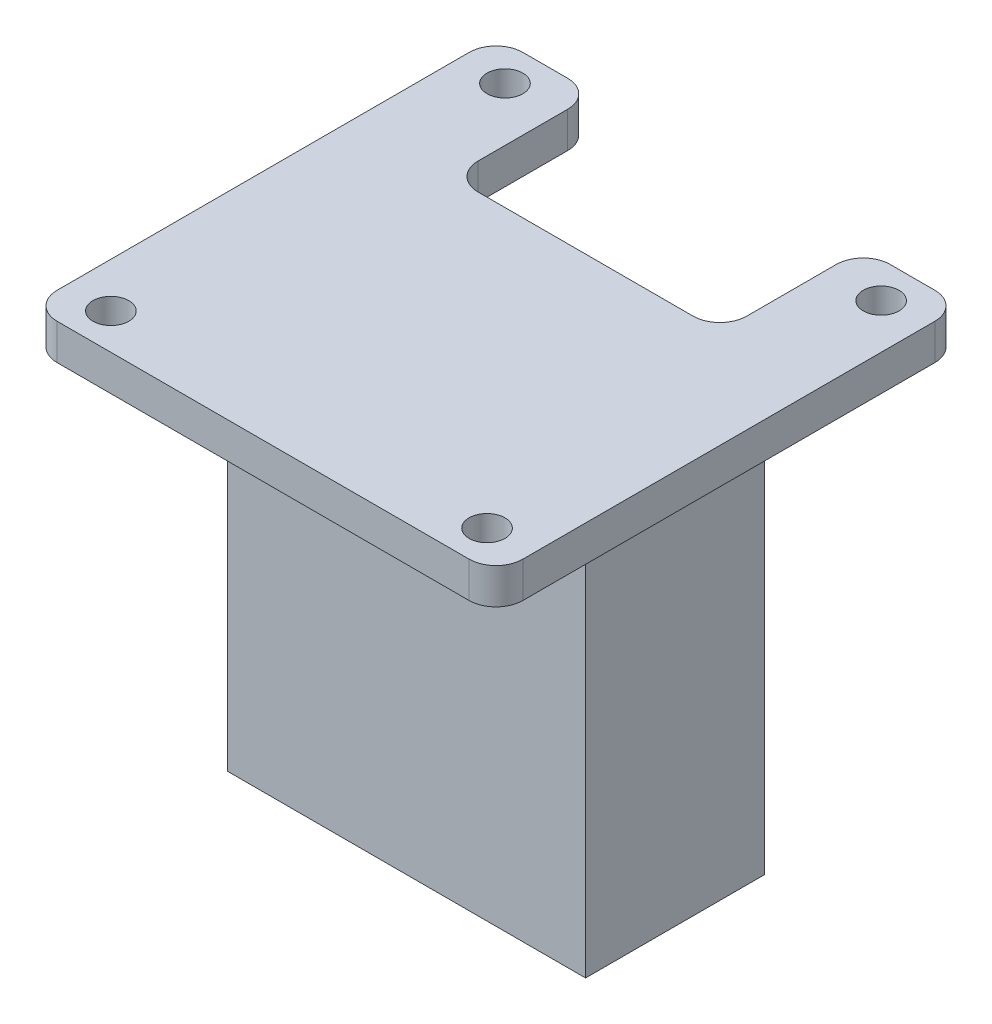
ISO-10303-21;
HEADER;
FILE_DESCRIPTION(('STEP AP214'),'2;1');
FILE_NAME('part.step','',(''),(''),'','','');
FILE_SCHEMA(('AUTOMOTIVE_DESIGN { 1 0 10303 214 1 1 1 1 }'));
ENDSEC;
DATA;
#1=APPLICATION_CONTEXT('core data for automotive mechanical design processes');
#2=APPLICATION_PROTOCOL_DEFINITION('international standard','automotive_design',2000,#1);
#3=PRODUCT_CONTEXT('',#1,'mechanical');
#4=PRODUCT('Part','Part','',(#3));
#5=PRODUCT_RELATED_PRODUCT_CATEGORY('part','',(#4));
#6=PRODUCT_DEFINITION_FORMATION('','',#4);
#7=PRODUCT_DEFINITION_CONTEXT('part definition',#1,'design');
#8=PRODUCT_DEFINITION('design','',#6,#7);
#9=PRODUCT_DEFINITION_SHAPE('','',#8);
#10=(LENGTH_UNIT() NAMED_UNIT(*) SI_UNIT(.MILLI.,.METRE.));
#11=(NAMED_UNIT(*) PLANE_ANGLE_UNIT() SI_UNIT($,.RADIAN.));
#12=(NAMED_UNIT(*) SI_UNIT($,.STERADIAN.) SOLID_ANGLE_UNIT());
#13=UNCERTAINTY_MEASURE_WITH_UNIT(LENGTH_MEASURE(1.E-05),#10,'distance_accuracy_value','');
#14=(GEOMETRIC_REPRESENTATION_CONTEXT(3) GLOBAL_UNCERTAINTY_ASSIGNED_CONTEXT((#13)) GLOBAL_UNIT_ASSIGNED_CONTEXT((#10,
#11,#12)) REPRESENTATION_CONTEXT('',''));
#15=CARTESIAN_POINT('',(0.,0.,0.));
#16=DIRECTION('',(0.,0.,1.));
#17=DIRECTION('',(1.,0.,0.));
#18=AXIS2_PLACEMENT_3D('',#15,#16,#17);
#19=CARTESIAN_POINT('',(13.,25.,-13.));
#20=DIRECTION('',(0.,0.,1.));
#21=DIRECTION('',(1.,0.,0.));
#22=AXIS2_PLACEMENT_3D('',#19,#20,#21);
#23=PLANE('',#22);
#24=DIRECTION('',(-1.,0.,0.));
#25=VECTOR('',#24,1.);
#26=CARTESIAN_POINT('',(13.,23.,-13.));
#27=LINE('',#26,#25);
#28=CARTESIAN_POINT('',(-9.,23.,-13.));
#29=VERTEX_POINT('',#28);
#30=CARTESIAN_POINT('',(-11.5,23.,-13.));
#31=VERTEX_POINT('',#30);
#32=EDGE_CURVE('E391',#29,#31,#27,.T.);
#33=ORIENTED_EDGE('',*,*,#32,.T.);
#34=DIRECTION('',(0.,-1.,0.));
#35=VECTOR('',#34,1.);
#36=CARTESIAN_POINT('',(-11.5,25.,-13.));
#37=LINE('',#36,#35);
#38=CARTESIAN_POINT('',(-11.5,25.,-13.));
#39=VERTEX_POINT('',#38);
#40=EDGE_CURVE('E252',#31,#39,#37,.F.);
#41=ORIENTED_EDGE('',*,*,#40,.T.);
#42=DIRECTION('',(-1.,0.,0.));
#43=VECTOR('',#42,1.);
#44=CARTESIAN_POINT('',(13.,25.,-13.));
#45=LINE('',#44,#43);
#46=CARTESIAN_POINT('',(-9.,25.,-13.));
#47=VERTEX_POINT('',#46);
#48=EDGE_CURVE('E379',#47,#39,#45,.T.);
#49=ORIENTED_EDGE('',*,*,#48,.F.);
#50=DIRECTION('',(0.,-1.,0.));
#51=VECTOR('',#50,1.);
#52=CARTESIAN_POINT('',(-9.,25.,-13.));
#53=LINE('',#52,#51);
#54=EDGE_CURVE('E249',#47,#29,#53,.T.);
#55=ORIENTED_EDGE('',*,*,#54,.T.);
#56=EDGE_LOOP('',(#33,#41,#49,#55));
#57=FACE_BOUND('',#56,.T.);
#58=ADVANCED_FACE('F36',(#57),#23,.F.);
#59=CARTESIAN_POINT('',(0.,0.,0.));
#60=DIRECTION('',(0.,1.,0.));
#61=DIRECTION('',(0.,0.,1.));
#62=AXIS2_PLACEMENT_3D('',#59,#60,#61);
#63=PLANE('',#62);
#64=DIRECTION('',(0.,0.,1.));
#65=VECTOR('',#64,1.);
#66=CARTESIAN_POINT('',(-10.,0.,5.));
#67=LINE('',#66,#65);
#68=CARTESIAN_POINT('',(-10.,0.,-5.));
#69=VERTEX_POINT('',#68);
#70=CARTESIAN_POINT('',(-10.,0.,5.));
#71=VERTEX_POINT('',#70);
#72=EDGE_CURVE('E201',#69,#71,#67,.T.);
#73=ORIENTED_EDGE('',*,*,#72,.F.);
#74=DIRECTION('',(-1.,0.,0.));
#75=VECTOR('',#74,1.);
#76=CARTESIAN_POINT('',(10.,0.,-5.));
#77=LINE('',#76,#75);
#78=CARTESIAN_POINT('',(10.,0.,-5.));
#79=VERTEX_POINT('',#78);
#80=EDGE_CURVE('E217',#79,#69,#77,.T.);
#81=ORIENTED_EDGE('',*,*,#80,.F.);
#82=DIRECTION('',(0.,0.,-1.));
#83=VECTOR('',#82,1.);
#84=CARTESIAN_POINT('',(10.,0.,5.));
#85=LINE('',#84,#83);
#86=CARTESIAN_POINT('',(10.,0.,5.));
#87=VERTEX_POINT('',#86);
#88=EDGE_CURVE('E203',#87,#79,#85,.T.);
#89=ORIENTED_EDGE('',*,*,#88,.F.);
#90=DIRECTION('',(1.,0.,0.));
#91=VECTOR('',#90,1.);
#92=CARTESIAN_POINT('',(10.,0.,5.));
#93=LINE('',#92,#91);
#94=EDGE_CURVE('E188',#71,#87,#93,.T.);
#95=ORIENTED_EDGE('',*,*,#94,.F.);
#96=EDGE_LOOP('',(#73,#81,#89,#95));
#97=FACE_BOUND('',#96,.T.);
#98=CARTESIAN_POINT('',(0.,0.,-1.5));
#99=DIRECTION('',(0.,1.,0.));
#100=DIRECTION('',(0.,0.,1.));
#101=AXIS2_PLACEMENT_3D('',#98,#99,#100);
#102=CIRCLE('',#101,1.45);
#103=CARTESIAN_POINT('',(0.,0.,-0.0499999999999997));
#104=VERTEX_POINT('',#103);
#105=EDGE_CURVE('E209',#104,#104,#102,.T.);
#106=ORIENTED_EDGE('',*,*,#105,.T.);
#107=EDGE_LOOP('',(#106));
#108=FACE_BOUND('',#107,.T.);
#109=ADVANCED_FACE('F198',(#97,#108),#63,.F.);
#110=CARTESIAN_POINT('',(-10.,23.,5.));
#111=DIRECTION('',(1.,0.,0.));
#112=DIRECTION('',(0.,0.,-1.));
#113=AXIS2_PLACEMENT_3D('',#110,#111,#112);
#114=PLANE('',#113);
#115=DIRECTION('',(0.,-1.,0.));
#116=VECTOR('',#115,1.);
#117=CARTESIAN_POINT('',(-10.,23.,5.));
#118=LINE('',#117,#116);
#119=CARTESIAN_POINT('',(-10.,21.5,5.));
#120=VERTEX_POINT('',#119);
#121=EDGE_CURVE('E185',#120,#71,#118,.T.);
#122=ORIENTED_EDGE('',*,*,#121,.F.);
#123=DIRECTION('',(0.,0.,1.));
#124=VECTOR('',#123,1.);
#125=CARTESIAN_POINT('',(-10.,21.5,-5.));
#126=LINE('',#125,#124);
#127=CARTESIAN_POINT('',(-10.,21.5,-5.));
#128=VERTEX_POINT('',#127);
#129=EDGE_CURVE('E301',#120,#128,#126,.F.);
#130=ORIENTED_EDGE('',*,*,#129,.T.);
#131=DIRECTION('',(0.,-1.,0.));
#132=VECTOR('',#131,1.);
#133=CARTESIAN_POINT('',(-10.,23.,-5.));
#134=LINE('',#133,#132);
#135=EDGE_CURVE('E207',#128,#69,#134,.T.);
#136=ORIENTED_EDGE('',*,*,#135,.T.);
#137=ORIENTED_EDGE('',*,*,#72,.T.);
#138=EDGE_LOOP('',(#122,#130,#136,#137));
#139=FACE_BOUND('',#138,.T.);
#140=ADVANCED_FACE('F205',(#139),#114,.F.);
#141=CARTESIAN_POINT('',(10.,23.,5.));
#142=DIRECTION('',(0.,0.,-1.));
#143=DIRECTION('',(-1.,0.,0.));
#144=AXIS2_PLACEMENT_3D('',#141,#142,#143);
#145=PLANE('',#144);
#146=DIRECTION('',(0.,-1.,0.));
#147=VECTOR('',#146,1.);
#148=CARTESIAN_POINT('',(10.,23.,5.));
#149=LINE('',#148,#147);
#150=CARTESIAN_POINT('',(10.,21.5,5.));
#151=VERTEX_POINT('',#150);
#152=EDGE_CURVE('E194',#151,#87,#149,.T.);
#153=ORIENTED_EDGE('',*,*,#152,.F.);
#154=DIRECTION('',(1.,0.,0.));
#155=VECTOR('',#154,1.);
#156=CARTESIAN_POINT('',(-10.,21.5,5.));
#157=LINE('',#156,#155);
#158=EDGE_CURVE('E53',#151,#120,#157,.F.);
#159=ORIENTED_EDGE('',*,*,#158,.T.);
#160=ORIENTED_EDGE('',*,*,#121,.T.);
#161=ORIENTED_EDGE('',*,*,#94,.T.);
#162=EDGE_LOOP('',(#153,#159,#160,#161));
#163=FACE_BOUND('',#162,.T.);
#164=ADVANCED_FACE('F187',(#163),#145,.F.);
#165=CARTESIAN_POINT('',(10.,23.,5.));
#166=DIRECTION('',(-1.,0.,0.));
#167=DIRECTION('',(0.,0.,1.));
#168=AXIS2_PLACEMENT_3D('',#165,#166,#167);
#169=PLANE('',#168);
#170=DIRECTION('',(0.,-1.,0.));
#171=VECTOR('',#170,1.);
#172=CARTESIAN_POINT('',(10.,23.,-5.));
#173=LINE('',#172,#171);
#174=CARTESIAN_POINT('',(10.,21.5,-5.));
#175=VERTEX_POINT('',#174);
#176=EDGE_CURVE('E220',#175,#79,#173,.T.);
#177=ORIENTED_EDGE('',*,*,#176,.F.);
#178=DIRECTION('',(0.,0.,-1.));
#179=VECTOR('',#178,1.);
#180=CARTESIAN_POINT('',(10.,21.5,5.));
#181=LINE('',#180,#179);
#182=EDGE_CURVE('E61',#175,#151,#181,.F.);
#183=ORIENTED_EDGE('',*,*,#182,.T.);
#184=ORIENTED_EDGE('',*,*,#152,.T.);
#185=ORIENTED_EDGE('',*,*,#88,.T.);
#186=EDGE_LOOP('',(#177,#183,#184,#185));
#187=FACE_BOUND('',#186,.T.);
#188=ADVANCED_FACE('F532',(#187),#169,.F.);
#189=CARTESIAN_POINT('',(10.,23.,-5.));
#190=DIRECTION('',(0.,0.,1.));
#191=DIRECTION('',(1.,0.,0.));
#192=AXIS2_PLACEMENT_3D('',#189,#190,#191);
#193=PLANE('',#192);
#194=DIRECTION('',(-1.,0.,0.));
#195=VECTOR('',#194,1.);
#196=CARTESIAN_POINT('',(-7.5,21.5,-5.));
#197=LINE('',#196,#195);
#198=CARTESIAN_POINT('',(-6.,21.5,-5.));
#199=VERTEX_POINT('',#198);
#200=EDGE_CURVE('E294',#128,#199,#197,.F.);
#201=ORIENTED_EDGE('',*,*,#200,.T.);
#202=DIRECTION('',(0.,1.,0.));
#203=VECTOR('',#202,1.);
#204=CARTESIAN_POINT('',(-6.,25.,-5.));
#205=LINE('',#204,#203);
#206=CARTESIAN_POINT('',(-6.,25.,-5.));
#207=VERTEX_POINT('',#206);
#208=EDGE_CURVE('E296',#199,#207,#205,.T.);
#209=ORIENTED_EDGE('',*,*,#208,.T.);
#210=DIRECTION('',(1.,0.,0.));
#211=VECTOR('',#210,1.);
#212=CARTESIAN_POINT('',(7.5,25.,-5.));
#213=LINE('',#212,#211);
#214=CARTESIAN_POINT('',(6.,25.,-5.));
#215=VERTEX_POINT('',#214);
#216=EDGE_CURVE('E327',#207,#215,#213,.T.);
#217=ORIENTED_EDGE('',*,*,#216,.T.);
#218=DIRECTION('',(0.,1.,0.));
#219=VECTOR('',#218,1.);
#220=CARTESIAN_POINT('',(6.,23.,-5.));
#221=LINE('',#220,#219);
#222=CARTESIAN_POINT('',(6.,21.5,-5.));
#223=VERTEX_POINT('',#222);
#224=EDGE_CURVE('E292',#215,#223,#221,.F.);
#225=ORIENTED_EDGE('',*,*,#224,.T.);
#226=DIRECTION('',(-1.,0.,0.));
#227=VECTOR('',#226,1.);
#228=CARTESIAN_POINT('',(10.,21.5,-5.));
#229=LINE('',#228,#227);
#230=EDGE_CURVE('E290',#223,#175,#229,.F.);
#231=ORIENTED_EDGE('',*,*,#230,.T.);
#232=ORIENTED_EDGE('',*,*,#176,.T.);
#233=ORIENTED_EDGE('',*,*,#80,.T.);
#234=ORIENTED_EDGE('',*,*,#135,.F.);
#235=EDGE_LOOP('',(#201,#209,#217,#225,#231,#232,#233,#234));
#236=FACE_BOUND('',#235,.T.);
#237=ADVANCED_FACE('F410',(#236),#193,.F.);
#238=CARTESIAN_POINT('',(0.,23.,-1.5));
#239=DIRECTION('',(0.,-1.,0.));
#240=DIRECTION('',(0.,0.,-1.));
#241=AXIS2_PLACEMENT_3D('',#238,#239,#240);
#242=CYLINDRICAL_SURFACE('',#241,1.45);
#243=CARTESIAN_POINT('',(0.,23.,-1.5));
#244=DIRECTION('',(0.,1.,0.));
#245=DIRECTION('',(0.,0.,1.));
#246=AXIS2_PLACEMENT_3D('',#243,#244,#245);
#247=CIRCLE('',#246,1.45);
#248=CARTESIAN_POINT('',(0.,23.,-0.0499999999999997));
#249=VERTEX_POINT('',#248);
#250=EDGE_CURVE('E212',#249,#249,#247,.T.);
#251=ORIENTED_EDGE('',*,*,#250,.T.);
#252=EDGE_LOOP('',(#251));
#253=FACE_BOUND('',#252,.T.);
#254=ORIENTED_EDGE('',*,*,#105,.F.);
#255=EDGE_LOOP('',(#254));
#256=FACE_BOUND('',#255,.T.);
#257=ADVANCED_FACE('F396',(#253,#256),#242,.F.);
#258=CARTESIAN_POINT('',(0.,23.,0.));
#259=DIRECTION('',(0.,1.,0.));
#260=DIRECTION('',(0.,0.,1.));
#261=AXIS2_PLACEMENT_3D('',#258,#259,#260);
#262=PLANE('',#261);
#263=ORIENTED_EDGE('',*,*,#250,.F.);
#264=EDGE_LOOP('',(#263));
#265=FACE_BOUND('',#264,.T.);
#266=ADVANCED_FACE('F399',(#265),#262,.F.);
#267=CARTESIAN_POINT('',(0.,25.,0.));
#268=DIRECTION('',(0.,1.,0.));
#269=DIRECTION('',(0.,0.,1.));
#270=AXIS2_PLACEMENT_3D('',#267,#268,#269);
#271=PLANE('',#270);
#272=ORIENTED_EDGE('',*,*,#48,.T.);
#273=CARTESIAN_POINT('',(-11.5,25.,-11.5));
#274=DIRECTION('',(0.,1.,0.));
#275=DIRECTION('',(0.,0.,1.));
#276=AXIS2_PLACEMENT_3D('',#273,#274,#275);
#277=CIRCLE('',#276,1.5);
#278=CARTESIAN_POINT('',(-13.,25.,-11.5));
#279=VERTEX_POINT('',#278);
#280=EDGE_CURVE('E264',#39,#279,#277,.T.);
#281=ORIENTED_EDGE('',*,*,#280,.T.);
#282=DIRECTION('',(0.,0.,1.));
#283=VECTOR('',#282,1.);
#284=CARTESIAN_POINT('',(-13.,25.,13.));
#285=LINE('',#284,#283);
#286=CARTESIAN_POINT('',(-13.,25.,11.5));
#287=VERTEX_POINT('',#286);
#288=EDGE_CURVE('E369',#279,#287,#285,.T.);
#289=ORIENTED_EDGE('',*,*,#288,.T.);
#290=CARTESIAN_POINT('',(-11.5,25.,11.5));
#291=DIRECTION('',(0.,1.,0.));
#292=DIRECTION('',(0.,0.,1.));
#293=AXIS2_PLACEMENT_3D('',#290,#291,#292);
#294=CIRCLE('',#293,1.5);
#295=CARTESIAN_POINT('',(-11.5,25.,13.));
#296=VERTEX_POINT('',#295);
#297=EDGE_CURVE('E256',#287,#296,#294,.T.);
#298=ORIENTED_EDGE('',*,*,#297,.T.);
#299=DIRECTION('',(1.,0.,0.));
#300=VECTOR('',#299,1.);
#301=CARTESIAN_POINT('',(0.,25.,13.));
#302=LINE('',#301,#300);
#303=CARTESIAN_POINT('',(11.5,25.,13.));
#304=VERTEX_POINT('',#303);
#305=EDGE_CURVE('E372',#296,#304,#302,.T.);
#306=ORIENTED_EDGE('',*,*,#305,.T.);
#307=CARTESIAN_POINT('',(11.5,25.,11.5));
#308=DIRECTION('',(0.,1.,0.));
#309=DIRECTION('',(0.,0.,1.));
#310=AXIS2_PLACEMENT_3D('',#307,#308,#309);
#311=CIRCLE('',#310,1.5);
#312=CARTESIAN_POINT('',(13.,25.,11.5));
#313=VERTEX_POINT('',#312);
#314=EDGE_CURVE('E254',#304,#313,#311,.T.);
#315=ORIENTED_EDGE('',*,*,#314,.T.);
#316=DIRECTION('',(0.,0.,-1.));
#317=VECTOR('',#316,1.);
#318=CARTESIAN_POINT('',(13.,25.,13.));
#319=LINE('',#318,#317);
#320=CARTESIAN_POINT('',(13.,25.,-11.5));
#321=VERTEX_POINT('',#320);
#322=EDGE_CURVE('E376',#313,#321,#319,.T.);
#323=ORIENTED_EDGE('',*,*,#322,.T.);
#324=CARTESIAN_POINT('',(11.5,25.,-11.5));
#325=DIRECTION('',(0.,1.,0.));
#326=DIRECTION('',(0.,0.,1.));
#327=AXIS2_PLACEMENT_3D('',#324,#325,#326);
#328=CIRCLE('',#327,1.5);
#329=CARTESIAN_POINT('',(11.5,25.,-13.));
#330=VERTEX_POINT('',#329);
#331=EDGE_CURVE('E260',#321,#330,#328,.T.);
#332=ORIENTED_EDGE('',*,*,#331,.T.);
#333=CARTESIAN_POINT('',(9.,25.,-13.));
#334=VERTEX_POINT('',#333);
#335=EDGE_CURVE('E380',#330,#334,#45,.T.);
#336=ORIENTED_EDGE('',*,*,#335,.T.);
#337=CARTESIAN_POINT('',(9.,25.,-11.5));
#338=DIRECTION('',(0.,1.,0.));
#339=DIRECTION('',(0.,0.,1.));
#340=AXIS2_PLACEMENT_3D('',#337,#338,#339);
#341=CIRCLE('',#340,1.5);
#342=CARTESIAN_POINT('',(7.5,25.,-11.5));
#343=VERTEX_POINT('',#342);
#344=EDGE_CURVE('E258',#334,#343,#341,.T.);
#345=ORIENTED_EDGE('',*,*,#344,.T.);
#346=DIRECTION('',(0.,0.,-1.));
#347=VECTOR('',#346,1.);
#348=CARTESIAN_POINT('',(7.5,25.,-21.));
#349=LINE('',#348,#347);
#350=CARTESIAN_POINT('',(7.5,25.,-6.5));
#351=VERTEX_POINT('',#350);
#352=EDGE_CURVE('E333',#351,#343,#349,.T.);
#353=ORIENTED_EDGE('',*,*,#352,.F.);
#354=CARTESIAN_POINT('',(6.,25.,-6.5));
#355=DIRECTION('',(0.,1.,0.));
#356=DIRECTION('',(0.,0.,1.));
#357=AXIS2_PLACEMENT_3D('',#354,#355,#356);
#358=CIRCLE('',#357,1.5);
#359=EDGE_CURVE('E11',#351,#215,#358,.F.);
#360=ORIENTED_EDGE('',*,*,#359,.T.);
#361=ORIENTED_EDGE('',*,*,#216,.F.);
#362=CARTESIAN_POINT('',(-6.,25.,-6.5));
#363=DIRECTION('',(0.,1.,0.));
#364=DIRECTION('',(0.,0.,1.));
#365=AXIS2_PLACEMENT_3D('',#362,#363,#364);
#366=CIRCLE('',#365,1.5);
#367=CARTESIAN_POINT('',(-7.5,25.,-6.5));
#368=VERTEX_POINT('',#367);
#369=EDGE_CURVE('E45',#207,#368,#366,.F.);
#370=ORIENTED_EDGE('',*,*,#369,.T.);
#371=DIRECTION('',(0.,0.,1.));
#372=VECTOR('',#371,1.);
#373=CARTESIAN_POINT('',(-7.5,25.,-21.));
#374=LINE('',#373,#372);
#375=CARTESIAN_POINT('',(-7.5,25.,-11.5));
#376=VERTEX_POINT('',#375);
#377=EDGE_CURVE('E321',#376,#368,#374,.T.);
#378=ORIENTED_EDGE('',*,*,#377,.F.);
#379=CARTESIAN_POINT('',(-9.,25.,-11.5));
#380=DIRECTION('',(0.,1.,0.));
#381=DIRECTION('',(0.,0.,1.));
#382=AXIS2_PLACEMENT_3D('',#379,#380,#381);
#383=CIRCLE('',#382,1.5);
#384=EDGE_CURVE('E262',#376,#47,#383,.T.);
#385=ORIENTED_EDGE('',*,*,#384,.T.);
#386=EDGE_LOOP('',(#272,#281,#289,#298,#306,#315,#323,#332,#336,#345,#353,#360,#361,#370,#378,#385));
#387=FACE_BOUND('',#386,.T.);
#388=CARTESIAN_POINT('',(10.5,25.,10.9999999999999));
#389=DIRECTION('',(0.,1.,0.));
#390=DIRECTION('',(0.,0.,1.));
#391=AXIS2_PLACEMENT_3D('',#388,#389,#390);
#392=CIRCLE('',#391,0.999999999999999);
#393=CARTESIAN_POINT('',(10.5,25.,11.9999999999999));
#394=VERTEX_POINT('',#393);
#395=EDGE_CURVE('E351',#394,#394,#392,.T.);
#396=ORIENTED_EDGE('',*,*,#395,.F.);
#397=EDGE_LOOP('',(#396));
#398=FACE_BOUND('',#397,.T.);
#399=CARTESIAN_POINT('',(-10.5,25.,-10.9999999999999));
#400=DIRECTION('',(0.,1.,0.));
#401=DIRECTION('',(0.,0.,1.));
#402=AXIS2_PLACEMENT_3D('',#399,#400,#401);
#403=CIRCLE('',#402,0.999999999999999);
#404=CARTESIAN_POINT('',(-10.5,25.,-9.9999999999999));
#405=VERTEX_POINT('',#404);
#406=EDGE_CURVE('E363',#405,#405,#403,.T.);
#407=ORIENTED_EDGE('',*,*,#406,.F.);
#408=EDGE_LOOP('',(#407));
#409=FACE_BOUND('',#408,.T.);
#410=CARTESIAN_POINT('',(10.5,25.,-10.9999999999999));
#411=DIRECTION('',(0.,1.,0.));
#412=DIRECTION('',(0.,0.,-1.));
#413=AXIS2_PLACEMENT_3D('',#410,#411,#412);
#414=CIRCLE('',#413,0.999999999999999);
#415=CARTESIAN_POINT('',(10.5,25.,-11.9999999999999));
#416=VERTEX_POINT('',#415);
#417=EDGE_CURVE('E357',#416,#416,#414,.T.);
#418=ORIENTED_EDGE('',*,*,#417,.F.);
#419=EDGE_LOOP('',(#418));
#420=FACE_BOUND('',#419,.T.);
#421=CARTESIAN_POINT('',(-10.5,25.,10.9999999999999));
#422=DIRECTION('',(0.,1.,0.));
#423=DIRECTION('',(0.,0.,-1.));
#424=AXIS2_PLACEMENT_3D('',#421,#422,#423);
#425=CIRCLE('',#424,0.999999999999999);
#426=CARTESIAN_POINT('',(-10.5,25.,9.9999999999999));
#427=VERTEX_POINT('',#426);
#428=EDGE_CURVE('E345',#427,#427,#425,.T.);
#429=ORIENTED_EDGE('',*,*,#428,.F.);
#430=EDGE_LOOP('',(#429));
#431=FACE_BOUND('',#430,.T.);
#432=ADVANCED_FACE('F401',(#387,#398,#409,#420,#431),#271,.T.);
#433=DIRECTION('',(0.,0.,1.));
#434=VECTOR('',#433,1.);
#435=CARTESIAN_POINT('',(-13.,23.,13.));
#436=LINE('',#435,#434);
#437=CARTESIAN_POINT('',(-13.,23.,-11.5));
#438=VERTEX_POINT('',#437);
#439=CARTESIAN_POINT('',(-13.,23.,11.5));
#440=VERTEX_POINT('',#439);
#441=EDGE_CURVE('E366',#438,#440,#436,.T.);
#442=ORIENTED_EDGE('',*,*,#441,.F.);
#443=CARTESIAN_POINT('',(-11.5,23.,-11.5));
#444=DIRECTION('',(0.,1.,0.));
#445=DIRECTION('',(0.,0.,1.));
#446=AXIS2_PLACEMENT_3D('',#443,#444,#445);
#447=CIRCLE('',#446,1.5);
#448=EDGE_CURVE('E247',#438,#31,#447,.F.);
#449=ORIENTED_EDGE('',*,*,#448,.T.);
#450=ORIENTED_EDGE('',*,*,#32,.F.);
#451=CARTESIAN_POINT('',(-9.,23.,-11.5));
#452=DIRECTION('',(0.,1.,0.));
#453=DIRECTION('',(0.,0.,1.));
#454=AXIS2_PLACEMENT_3D('',#451,#452,#453);
#455=CIRCLE('',#454,1.5);
#456=CARTESIAN_POINT('',(-7.5,23.,-11.5));
#457=VERTEX_POINT('',#456);
#458=EDGE_CURVE('E245',#29,#457,#455,.F.);
#459=ORIENTED_EDGE('',*,*,#458,.T.);
#460=DIRECTION('',(0.,0.,1.));
#461=VECTOR('',#460,1.);
#462=CARTESIAN_POINT('',(-7.5,23.,0.));
#463=LINE('',#462,#461);
#464=CARTESIAN_POINT('',(-7.5,23.,-6.5));
#465=VERTEX_POINT('',#464);
#466=EDGE_CURVE('E341',#457,#465,#463,.T.);
#467=ORIENTED_EDGE('',*,*,#466,.T.);
#468=DIRECTION('',(-1.,0.,0.));
#469=VECTOR('',#468,1.);
#470=CARTESIAN_POINT('',(-10.,23.,-6.5));
#471=LINE('',#470,#469);
#472=CARTESIAN_POINT('',(-11.5,23.,-6.5));
#473=VERTEX_POINT('',#472);
#474=EDGE_CURVE('E235',#465,#473,#471,.T.);
#475=ORIENTED_EDGE('',*,*,#474,.T.);
#476=DIRECTION('',(0.,0.,1.));
#477=VECTOR('',#476,1.);
#478=CARTESIAN_POINT('',(-11.5,23.,5.));
#479=LINE('',#478,#477);
#480=CARTESIAN_POINT('',(-11.5,23.,6.5));
#481=VERTEX_POINT('',#480);
#482=EDGE_CURVE('E227',#473,#481,#479,.T.);
#483=ORIENTED_EDGE('',*,*,#482,.T.);
#484=DIRECTION('',(1.,0.,0.));
#485=VECTOR('',#484,1.);
#486=CARTESIAN_POINT('',(10.,23.,6.5));
#487=LINE('',#486,#485);
#488=CARTESIAN_POINT('',(11.5,23.,6.5));
#489=VERTEX_POINT('',#488);
#490=EDGE_CURVE('E229',#481,#489,#487,.T.);
#491=ORIENTED_EDGE('',*,*,#490,.T.);
#492=DIRECTION('',(0.,0.,-1.));
#493=VECTOR('',#492,1.);
#494=CARTESIAN_POINT('',(11.5,23.,-5.));
#495=LINE('',#494,#493);
#496=CARTESIAN_POINT('',(11.5,23.,-6.5));
#497=VERTEX_POINT('',#496);
#498=EDGE_CURVE('E231',#489,#497,#495,.T.);
#499=ORIENTED_EDGE('',*,*,#498,.T.);
#500=DIRECTION('',(-1.,0.,0.));
#501=VECTOR('',#500,1.);
#502=CARTESIAN_POINT('',(7.5,23.,-6.5));
#503=LINE('',#502,#501);
#504=CARTESIAN_POINT('',(7.5,23.,-6.5));
#505=VERTEX_POINT('',#504);
#506=EDGE_CURVE('E233',#497,#505,#503,.T.);
#507=ORIENTED_EDGE('',*,*,#506,.T.);
#508=DIRECTION('',(0.,0.,-1.));
#509=VECTOR('',#508,1.);
#510=CARTESIAN_POINT('',(7.5,23.,0.));
#511=LINE('',#510,#509);
#512=CARTESIAN_POINT('',(7.5,23.,-11.5));
#513=VERTEX_POINT('',#512);
#514=EDGE_CURVE('E338',#505,#513,#511,.T.);
#515=ORIENTED_EDGE('',*,*,#514,.T.);
#516=CARTESIAN_POINT('',(9.,23.,-11.5));
#517=DIRECTION('',(0.,1.,0.));
#518=DIRECTION('',(0.,0.,1.));
#519=AXIS2_PLACEMENT_3D('',#516,#517,#518);
#520=CIRCLE('',#519,1.5);
#521=CARTESIAN_POINT('',(9.,23.,-13.));
#522=VERTEX_POINT('',#521);
#523=EDGE_CURVE('E241',#513,#522,#520,.F.);
#524=ORIENTED_EDGE('',*,*,#523,.T.);
#525=CARTESIAN_POINT('',(11.5,23.,-13.));
#526=VERTEX_POINT('',#525);
#527=EDGE_CURVE('E373',#526,#522,#27,.T.);
#528=ORIENTED_EDGE('',*,*,#527,.F.);
#529=CARTESIAN_POINT('',(11.5,23.,-11.5));
#530=DIRECTION('',(0.,1.,0.));
#531=DIRECTION('',(0.,0.,1.));
#532=AXIS2_PLACEMENT_3D('',#529,#530,#531);
#533=CIRCLE('',#532,1.5);
#534=CARTESIAN_POINT('',(13.,23.,-11.5));
#535=VERTEX_POINT('',#534);
#536=EDGE_CURVE('E243',#526,#535,#533,.F.);
#537=ORIENTED_EDGE('',*,*,#536,.T.);
#538=DIRECTION('',(0.,0.,-1.));
#539=VECTOR('',#538,1.);
#540=CARTESIAN_POINT('',(13.,23.,13.));
#541=LINE('',#540,#539);
#542=CARTESIAN_POINT('',(13.,23.,11.5));
#543=VERTEX_POINT('',#542);
#544=EDGE_CURVE('E388',#543,#535,#541,.T.);
#545=ORIENTED_EDGE('',*,*,#544,.F.);
#546=CARTESIAN_POINT('',(11.5,23.,11.5));
#547=DIRECTION('',(0.,1.,0.));
#548=DIRECTION('',(0.,0.,1.));
#549=AXIS2_PLACEMENT_3D('',#546,#547,#548);
#550=CIRCLE('',#549,1.5);
#551=CARTESIAN_POINT('',(11.5,23.,13.));
#552=VERTEX_POINT('',#551);
#553=EDGE_CURVE('E237',#543,#552,#550,.F.);
#554=ORIENTED_EDGE('',*,*,#553,.T.);
#555=DIRECTION('',(1.,0.,0.));
#556=VECTOR('',#555,1.);
#557=CARTESIAN_POINT('',(13.,23.,13.));
#558=LINE('',#557,#556);
#559=CARTESIAN_POINT('',(-11.5,23.,13.));
#560=VERTEX_POINT('',#559);
#561=EDGE_CURVE('E385',#560,#552,#558,.T.);
#562=ORIENTED_EDGE('',*,*,#561,.F.);
#563=CARTESIAN_POINT('',(-11.5,23.,11.5));
#564=DIRECTION('',(0.,1.,0.));
#565=DIRECTION('',(0.,0.,1.));
#566=AXIS2_PLACEMENT_3D('',#563,#564,#565);
#567=CIRCLE('',#566,1.5);
#568=EDGE_CURVE('E239',#560,#440,#567,.F.);
#569=ORIENTED_EDGE('',*,*,#568,.T.);
#570=EDGE_LOOP('',(#442,#449,#450,#459,#467,#475,#483,#491,#499,#507,#515,#524,#528,#537,#545,
#554,#562,#569));
#571=FACE_BOUND('',#570,.T.);
#572=CARTESIAN_POINT('',(-10.5,23.,-10.9999999999999));
#573=DIRECTION('',(0.,1.,0.));
#574=DIRECTION('',(0.,0.,1.));
#575=AXIS2_PLACEMENT_3D('',#572,#573,#574);
#576=CIRCLE('',#575,0.999999999999999);
#577=CARTESIAN_POINT('',(-10.5,23.,-9.9999999999999));
#578=VERTEX_POINT('',#577);
#579=EDGE_CURVE('E360',#578,#578,#576,.T.);
#580=ORIENTED_EDGE('',*,*,#579,.T.);
#581=EDGE_LOOP('',(#580));
#582=FACE_BOUND('',#581,.T.);
#583=CARTESIAN_POINT('',(10.5,23.,-10.9999999999999));
#584=DIRECTION('',(0.,1.,0.));
#585=DIRECTION('',(0.,0.,-1.));
#586=AXIS2_PLACEMENT_3D('',#583,#584,#585);
#587=CIRCLE('',#586,0.999999999999999);
#588=CARTESIAN_POINT('',(10.5,23.,-11.9999999999999));
#589=VERTEX_POINT('',#588);
#590=EDGE_CURVE('E354',#589,#589,#587,.T.);
#591=ORIENTED_EDGE('',*,*,#590,.T.);
#592=EDGE_LOOP('',(#591));
#593=FACE_BOUND('',#592,.T.);
#594=CARTESIAN_POINT('',(10.5,23.,10.9999999999999));
#595=DIRECTION('',(0.,1.,0.));
#596=DIRECTION('',(0.,0.,1.));
#597=AXIS2_PLACEMENT_3D('',#594,#595,#596);
#598=CIRCLE('',#597,0.999999999999999);
#599=CARTESIAN_POINT('',(10.5,23.,11.9999999999999));
#600=VERTEX_POINT('',#599);
#601=EDGE_CURVE('E348',#600,#600,#598,.T.);
#602=ORIENTED_EDGE('',*,*,#601,.T.);
#603=EDGE_LOOP('',(#602));
#604=FACE_BOUND('',#603,.T.);
#605=CARTESIAN_POINT('',(-10.5,23.,10.9999999999999));
#606=DIRECTION('',(0.,1.,0.));
#607=DIRECTION('',(0.,0.,-1.));
#608=AXIS2_PLACEMENT_3D('',#605,#606,#607);
#609=CIRCLE('',#608,0.999999999999999);
#610=CARTESIAN_POINT('',(-10.5,23.,9.9999999999999));
#611=VERTEX_POINT('',#610);
#612=EDGE_CURVE('E344',#611,#611,#609,.T.);
#613=ORIENTED_EDGE('',*,*,#612,.T.);
#614=EDGE_LOOP('',(#613));
#615=FACE_BOUND('',#614,.T.);
#616=ADVANCED_FACE('F403',(#571,#582,#593,#604,#615),#262,.F.);
#617=CARTESIAN_POINT('',(-13.,25.,13.));
#618=DIRECTION('',(1.,0.,0.));
#619=DIRECTION('',(0.,0.,-1.));
#620=AXIS2_PLACEMENT_3D('',#617,#618,#619);
#621=PLANE('',#620);
#622=ORIENTED_EDGE('',*,*,#288,.F.);
#623=DIRECTION('',(0.,-1.,0.));
#624=VECTOR('',#623,1.);
#625=CARTESIAN_POINT('',(-13.,25.,-11.5));
#626=LINE('',#625,#624);
#627=EDGE_CURVE('E224',#279,#438,#626,.T.);
#628=ORIENTED_EDGE('',*,*,#627,.T.);
#629=ORIENTED_EDGE('',*,*,#441,.T.);
#630=DIRECTION('',(0.,-1.,0.));
#631=VECTOR('',#630,1.);
#632=CARTESIAN_POINT('',(-13.,25.,11.5));
#633=LINE('',#632,#631);
#634=EDGE_CURVE('E193',#440,#287,#633,.F.);
#635=ORIENTED_EDGE('',*,*,#634,.T.);
#636=EDGE_LOOP('',(#622,#628,#629,#635));
#637=FACE_BOUND('',#636,.T.);
#638=ADVANCED_FACE('F414',(#637),#621,.F.);
#639=CARTESIAN_POINT('',(13.,25.,13.));
#640=DIRECTION('',(0.,0.,-1.));
#641=DIRECTION('',(-1.,0.,0.));
#642=AXIS2_PLACEMENT_3D('',#639,#640,#641);
#643=PLANE('',#642);
#644=ORIENTED_EDGE('',*,*,#305,.F.);
#645=DIRECTION('',(0.,-1.,0.));
#646=VECTOR('',#645,1.);
#647=CARTESIAN_POINT('',(-11.5,25.,13.));
#648=LINE('',#647,#646);
#649=EDGE_CURVE('E287',#296,#560,#648,.T.);
#650=ORIENTED_EDGE('',*,*,#649,.T.);
#651=ORIENTED_EDGE('',*,*,#561,.T.);
#652=DIRECTION('',(0.,-1.,0.));
#653=VECTOR('',#652,1.);
#654=CARTESIAN_POINT('',(11.5,25.,13.));
#655=LINE('',#654,#653);
#656=EDGE_CURVE('E285',#552,#304,#655,.F.);
#657=ORIENTED_EDGE('',*,*,#656,.T.);
#658=EDGE_LOOP('',(#644,#650,#651,#657));
#659=FACE_BOUND('',#658,.T.);
#660=ADVANCED_FACE('F436',(#659),#643,.F.);
#661=CARTESIAN_POINT('',(13.,25.,13.));
#662=DIRECTION('',(-1.,0.,0.));
#663=DIRECTION('',(0.,0.,1.));
#664=AXIS2_PLACEMENT_3D('',#661,#662,#663);
#665=PLANE('',#664);
#666=ORIENTED_EDGE('',*,*,#544,.T.);
#667=DIRECTION('',(0.,-1.,0.));
#668=VECTOR('',#667,1.);
#669=CARTESIAN_POINT('',(13.,25.,-11.5));
#670=LINE('',#669,#668);
#671=EDGE_CURVE('E279',#535,#321,#670,.F.);
#672=ORIENTED_EDGE('',*,*,#671,.T.);
#673=ORIENTED_EDGE('',*,*,#322,.F.);
#674=DIRECTION('',(0.,-1.,0.));
#675=VECTOR('',#674,1.);
#676=CARTESIAN_POINT('',(13.,25.,11.5));
#677=LINE('',#676,#675);
#678=EDGE_CURVE('E276',#313,#543,#677,.T.);
#679=ORIENTED_EDGE('',*,*,#678,.T.);
#680=EDGE_LOOP('',(#666,#672,#673,#679));
#681=FACE_BOUND('',#680,.T.);
#682=ADVANCED_FACE('F427',(#681),#665,.F.);
#683=ORIENTED_EDGE('',*,*,#335,.F.);
#684=DIRECTION('',(0.,-1.,0.));
#685=VECTOR('',#684,1.);
#686=CARTESIAN_POINT('',(11.5,25.,-13.));
#687=LINE('',#686,#685);
#688=EDGE_CURVE('E273',#330,#526,#687,.T.);
#689=ORIENTED_EDGE('',*,*,#688,.T.);
#690=ORIENTED_EDGE('',*,*,#527,.T.);
#691=DIRECTION('',(0.,1.,0.));
#692=VECTOR('',#691,1.);
#693=CARTESIAN_POINT('',(9.,25.,-13.));
#694=LINE('',#693,#692);
#695=EDGE_CURVE('E270',#522,#334,#694,.T.);
#696=ORIENTED_EDGE('',*,*,#695,.T.);
#697=EDGE_LOOP('',(#683,#689,#690,#696));
#698=FACE_BOUND('',#697,.T.);
#699=ADVANCED_FACE('F418',(#698),#23,.F.);
#700=CARTESIAN_POINT('',(-10.5,25.,-10.9999999999999));
#701=DIRECTION('',(0.,-1.,0.));
#702=DIRECTION('',(0.,0.,-1.));
#703=AXIS2_PLACEMENT_3D('',#700,#701,#702);
#704=CYLINDRICAL_SURFACE('',#703,0.999999999999999);
#705=ORIENTED_EDGE('',*,*,#406,.T.);
#706=EDGE_LOOP('',(#705));
#707=FACE_BOUND('',#706,.T.);
#708=ORIENTED_EDGE('',*,*,#579,.F.);
#709=EDGE_LOOP('',(#708));
#710=FACE_BOUND('',#709,.T.);
#711=ADVANCED_FACE('F426',(#707,#710),#704,.F.);
#712=CARTESIAN_POINT('',(10.5,25.,-10.9999999999999));
#713=DIRECTION('',(0.,-1.,0.));
#714=DIRECTION('',(0.,0.,-1.));
#715=AXIS2_PLACEMENT_3D('',#712,#713,#714);
#716=CYLINDRICAL_SURFACE('',#715,0.999999999999999);
#717=ORIENTED_EDGE('',*,*,#417,.T.);
#718=EDGE_LOOP('',(#717));
#719=FACE_BOUND('',#718,.T.);
#720=ORIENTED_EDGE('',*,*,#590,.F.);
#721=EDGE_LOOP('',(#720));
#722=FACE_BOUND('',#721,.T.);
#723=ADVANCED_FACE('F433',(#719,#722),#716,.F.);
#724=CARTESIAN_POINT('',(10.5,25.,10.9999999999999));
#725=DIRECTION('',(0.,-1.,0.));
#726=DIRECTION('',(0.,0.,-1.));
#727=AXIS2_PLACEMENT_3D('',#724,#725,#726);
#728=CYLINDRICAL_SURFACE('',#727,0.999999999999999);
#729=ORIENTED_EDGE('',*,*,#395,.T.);
#730=EDGE_LOOP('',(#729));
#731=FACE_BOUND('',#730,.T.);
#732=ORIENTED_EDGE('',*,*,#601,.F.);
#733=EDGE_LOOP('',(#732));
#734=FACE_BOUND('',#733,.T.);
#735=ADVANCED_FACE('F674',(#731,#734),#728,.F.);
#736=CARTESIAN_POINT('',(-10.5,25.,10.9999999999999));
#737=DIRECTION('',(0.,-1.,0.));
#738=DIRECTION('',(0.,0.,-1.));
#739=AXIS2_PLACEMENT_3D('',#736,#737,#738);
#740=CYLINDRICAL_SURFACE('',#739,0.999999999999999);
#741=ORIENTED_EDGE('',*,*,#428,.T.);
#742=EDGE_LOOP('',(#741));
#743=FACE_BOUND('',#742,.T.);
#744=ORIENTED_EDGE('',*,*,#612,.F.);
#745=EDGE_LOOP('',(#744));
#746=FACE_BOUND('',#745,.T.);
#747=ADVANCED_FACE('F563',(#743,#746),#740,.F.);
#748=CARTESIAN_POINT('',(-7.5,10.,-21.));
#749=DIRECTION('',(-1.,0.,0.));
#750=DIRECTION('',(0.,0.,1.));
#751=AXIS2_PLACEMENT_3D('',#748,#749,#750);
#752=PLANE('',#751);
#753=ORIENTED_EDGE('',*,*,#466,.F.);
#754=DIRECTION('',(0.,-1.,0.));
#755=VECTOR('',#754,1.);
#756=CARTESIAN_POINT('',(-7.5,10.,-11.5));
#757=LINE('',#756,#755);
#758=EDGE_CURVE('E268',#457,#376,#757,.F.);
#759=ORIENTED_EDGE('',*,*,#758,.T.);
#760=ORIENTED_EDGE('',*,*,#377,.T.);
#761=DIRECTION('',(0.,1.,0.));
#762=VECTOR('',#761,1.);
#763=CARTESIAN_POINT('',(-7.5,23.,-6.5));
#764=LINE('',#763,#762);
#765=EDGE_CURVE('E266',#368,#465,#764,.F.);
#766=ORIENTED_EDGE('',*,*,#765,.T.);
#767=EDGE_LOOP('',(#753,#759,#760,#766));
#768=FACE_BOUND('',#767,.T.);
#769=ADVANCED_FACE('F480',(#768),#752,.F.);
#770=CARTESIAN_POINT('',(7.5,10.,-21.));
#771=DIRECTION('',(1.,0.,0.));
#772=DIRECTION('',(0.,0.,-1.));
#773=AXIS2_PLACEMENT_3D('',#770,#771,#772);
#774=PLANE('',#773);
#775=ORIENTED_EDGE('',*,*,#352,.T.);
#776=DIRECTION('',(0.,1.,0.));
#777=VECTOR('',#776,1.);
#778=CARTESIAN_POINT('',(7.5,10.,-11.5));
#779=LINE('',#778,#777);
#780=EDGE_CURVE('E283',#343,#513,#779,.F.);
#781=ORIENTED_EDGE('',*,*,#780,.T.);
#782=ORIENTED_EDGE('',*,*,#514,.F.);
#783=DIRECTION('',(0.,1.,0.));
#784=VECTOR('',#783,1.);
#785=CARTESIAN_POINT('',(7.5,25.,-6.5));
#786=LINE('',#785,#784);
#787=EDGE_CURVE('E281',#505,#351,#786,.T.);
#788=ORIENTED_EDGE('',*,*,#787,.T.);
#789=EDGE_LOOP('',(#775,#781,#782,#788));
#790=FACE_BOUND('',#789,.T.);
#791=ADVANCED_FACE('F527',(#790),#774,.F.);
#792=CARTESIAN_POINT('',(-11.5,25.,-11.5));
#793=DIRECTION('',(0.,-1.,0.));
#794=DIRECTION('',(0.,0.,-1.));
#795=AXIS2_PLACEMENT_3D('',#792,#793,#794);
#796=CYLINDRICAL_SURFACE('',#795,1.5);
#797=ORIENTED_EDGE('',*,*,#280,.F.);
#798=ORIENTED_EDGE('',*,*,#40,.F.);
#799=ORIENTED_EDGE('',*,*,#448,.F.);
#800=ORIENTED_EDGE('',*,*,#627,.F.);
#801=EDGE_LOOP('',(#797,#798,#799,#800));
#802=FACE_BOUND('',#801,.T.);
#803=ADVANCED_FACE('F468',(#802),#796,.T.);
#804=CARTESIAN_POINT('',(-9.,25.,-11.5));
#805=DIRECTION('',(0.,-1.,0.));
#806=DIRECTION('',(0.,0.,-1.));
#807=AXIS2_PLACEMENT_3D('',#804,#805,#806);
#808=CYLINDRICAL_SURFACE('',#807,1.5);
#809=ORIENTED_EDGE('',*,*,#384,.F.);
#810=ORIENTED_EDGE('',*,*,#758,.F.);
#811=ORIENTED_EDGE('',*,*,#458,.F.);
#812=ORIENTED_EDGE('',*,*,#54,.F.);
#813=EDGE_LOOP('',(#809,#810,#811,#812));
#814=FACE_BOUND('',#813,.T.);
#815=ADVANCED_FACE('F476',(#814),#808,.T.);
#816=CARTESIAN_POINT('',(11.5,25.,-11.5));
#817=DIRECTION('',(0.,-1.,0.));
#818=DIRECTION('',(0.,0.,-1.));
#819=AXIS2_PLACEMENT_3D('',#816,#817,#818);
#820=CYLINDRICAL_SURFACE('',#819,1.5);
#821=ORIENTED_EDGE('',*,*,#331,.F.);
#822=ORIENTED_EDGE('',*,*,#671,.F.);
#823=ORIENTED_EDGE('',*,*,#536,.F.);
#824=ORIENTED_EDGE('',*,*,#688,.F.);
#825=EDGE_LOOP('',(#821,#822,#823,#824));
#826=FACE_BOUND('',#825,.T.);
#827=ADVANCED_FACE('F444',(#826),#820,.T.);
#828=CARTESIAN_POINT('',(9.,25.,-11.5));
#829=DIRECTION('',(0.,1.,0.));
#830=DIRECTION('',(0.,0.,1.));
#831=AXIS2_PLACEMENT_3D('',#828,#829,#830);
#832=CYLINDRICAL_SURFACE('',#831,1.5);
#833=ORIENTED_EDGE('',*,*,#523,.F.);
#834=ORIENTED_EDGE('',*,*,#780,.F.);
#835=ORIENTED_EDGE('',*,*,#344,.F.);
#836=ORIENTED_EDGE('',*,*,#695,.F.);
#837=EDGE_LOOP('',(#833,#834,#835,#836));
#838=FACE_BOUND('',#837,.T.);
#839=ADVANCED_FACE('F517',(#838),#832,.T.);
#840=CARTESIAN_POINT('',(-11.5,25.,11.5));
#841=DIRECTION('',(0.,-1.,0.));
#842=DIRECTION('',(0.,0.,-1.));
#843=AXIS2_PLACEMENT_3D('',#840,#841,#842);
#844=CYLINDRICAL_SURFACE('',#843,1.5);
#845=ORIENTED_EDGE('',*,*,#297,.F.);
#846=ORIENTED_EDGE('',*,*,#634,.F.);
#847=ORIENTED_EDGE('',*,*,#568,.F.);
#848=ORIENTED_EDGE('',*,*,#649,.F.);
#849=EDGE_LOOP('',(#845,#846,#847,#848));
#850=FACE_BOUND('',#849,.T.);
#851=ADVANCED_FACE('F461',(#850),#844,.T.);
#852=CARTESIAN_POINT('',(11.5,25.,11.5));
#853=DIRECTION('',(0.,-1.,0.));
#854=DIRECTION('',(0.,0.,-1.));
#855=AXIS2_PLACEMENT_3D('',#852,#853,#854);
#856=CYLINDRICAL_SURFACE('',#855,1.5);
#857=ORIENTED_EDGE('',*,*,#314,.F.);
#858=ORIENTED_EDGE('',*,*,#656,.F.);
#859=ORIENTED_EDGE('',*,*,#553,.F.);
#860=ORIENTED_EDGE('',*,*,#678,.F.);
#861=EDGE_LOOP('',(#857,#858,#859,#860));
#862=FACE_BOUND('',#861,.T.);
#863=ADVANCED_FACE('F453',(#862),#856,.T.);
#864=CARTESIAN_POINT('',(6.,10.,-6.5));
#865=DIRECTION('',(0.,-1.,0.));
#866=DIRECTION('',(0.,0.,-1.));
#867=AXIS2_PLACEMENT_3D('',#864,#865,#866);
#868=CYLINDRICAL_SURFACE('',#867,1.5);
#869=ORIENTED_EDGE('',*,*,#359,.F.);
#870=ORIENTED_EDGE('',*,*,#787,.F.);
#871=CARTESIAN_POINT('',(6.,21.5,-6.5));
#872=DIRECTION('',(0.707106781186547,-0.707106781186547,0.));
#873=DIRECTION('',(0.707106781186547,0.707106781186547,0.));
#874=AXIS2_PLACEMENT_3D('',#871,#872,#873);
#875=ELLIPSE('',#874,2.12132034355964,1.5);
#876=EDGE_CURVE('E40',#223,#505,#875,.F.);
#877=ORIENTED_EDGE('',*,*,#876,.F.);
#878=ORIENTED_EDGE('',*,*,#224,.F.);
#879=EDGE_LOOP('',(#869,#870,#877,#878));
#880=FACE_BOUND('',#879,.T.);
#881=ADVANCED_FACE('F38',(#880),#868,.F.);
#882=CARTESIAN_POINT('',(0.,21.5,-6.5));
#883=DIRECTION('',(1.,0.,0.));
#884=DIRECTION('',(0.,0.,-1.));
#885=AXIS2_PLACEMENT_3D('',#882,#883,#884);
#886=CYLINDRICAL_SURFACE('',#885,1.5);
#887=ORIENTED_EDGE('',*,*,#876,.T.);
#888=ORIENTED_EDGE('',*,*,#506,.F.);
#889=CARTESIAN_POINT('',(11.5,21.5,-6.5));
#890=DIRECTION('',(0.707106781186547,0.,0.707106781186547));
#891=DIRECTION('',(-0.707106781186547,0.,0.707106781186547));
#892=AXIS2_PLACEMENT_3D('',#889,#890,#891);
#893=ELLIPSE('',#892,2.12132034355964,1.5);
#894=EDGE_CURVE('E315',#175,#497,#893,.F.);
#895=ORIENTED_EDGE('',*,*,#894,.F.);
#896=ORIENTED_EDGE('',*,*,#230,.F.);
#897=EDGE_LOOP('',(#887,#888,#895,#896));
#898=FACE_BOUND('',#897,.T.);
#899=ADVANCED_FACE('F499',(#898),#886,.F.);
#900=CARTESIAN_POINT('',(11.5,21.5,0.));
#901=DIRECTION('',(0.,0.,1.));
#902=DIRECTION('',(1.,0.,0.));
#903=AXIS2_PLACEMENT_3D('',#900,#901,#902);
#904=CYLINDRICAL_SURFACE('',#903,1.5);
#905=ORIENTED_EDGE('',*,*,#894,.T.);
#906=ORIENTED_EDGE('',*,*,#498,.F.);
#907=CARTESIAN_POINT('',(11.5,21.5,6.5));
#908=DIRECTION('',(-0.707106781186547,0.,0.707106781186548));
#909=DIRECTION('',(-0.707106781186548,0.,-0.707106781186547));
#910=AXIS2_PLACEMENT_3D('',#907,#908,#909);
#911=ELLIPSE('',#910,2.12132034355964,1.5);
#912=EDGE_CURVE('E313',#151,#489,#911,.F.);
#913=ORIENTED_EDGE('',*,*,#912,.F.);
#914=ORIENTED_EDGE('',*,*,#182,.F.);
#915=EDGE_LOOP('',(#905,#906,#913,#914));
#916=FACE_BOUND('',#915,.T.);
#917=ADVANCED_FACE('F497',(#916),#904,.F.);
#918=CARTESIAN_POINT('',(0.,21.5,6.5));
#919=DIRECTION('',(-1.,0.,0.));
#920=DIRECTION('',(0.,0.,1.));
#921=AXIS2_PLACEMENT_3D('',#918,#919,#920);
#922=CYLINDRICAL_SURFACE('',#921,1.5);
#923=ORIENTED_EDGE('',*,*,#912,.T.);
#924=ORIENTED_EDGE('',*,*,#490,.F.);
#925=CARTESIAN_POINT('',(-11.5,21.5,6.5));
#926=DIRECTION('',(-0.707106781186548,0.,-0.707106781186547));
#927=DIRECTION('',(0.707106781186547,0.,-0.707106781186548));
#928=AXIS2_PLACEMENT_3D('',#925,#926,#927);
#929=ELLIPSE('',#928,2.12132034355964,1.5);
#930=EDGE_CURVE('E310',#120,#481,#929,.F.);
#931=ORIENTED_EDGE('',*,*,#930,.F.);
#932=ORIENTED_EDGE('',*,*,#158,.F.);
#933=EDGE_LOOP('',(#923,#924,#931,#932));
#934=FACE_BOUND('',#933,.T.);
#935=ADVANCED_FACE('F495',(#934),#922,.F.);
#936=CARTESIAN_POINT('',(-11.5,21.5,0.));
#937=DIRECTION('',(0.,0.,-1.));
#938=DIRECTION('',(-1.,0.,0.));
#939=AXIS2_PLACEMENT_3D('',#936,#937,#938);
#940=CYLINDRICAL_SURFACE('',#939,1.5);
#941=ORIENTED_EDGE('',*,*,#930,.T.);
#942=ORIENTED_EDGE('',*,*,#482,.F.);
#943=CARTESIAN_POINT('',(-11.5,21.5,-6.5));
#944=DIRECTION('',(0.707106781186547,0.,-0.707106781186547));
#945=DIRECTION('',(-0.707106781186547,0.,-0.707106781186547));
#946=AXIS2_PLACEMENT_3D('',#943,#944,#945);
#947=ELLIPSE('',#946,2.12132034355964,1.5);
#948=EDGE_CURVE('E307',#128,#473,#947,.F.);
#949=ORIENTED_EDGE('',*,*,#948,.F.);
#950=ORIENTED_EDGE('',*,*,#129,.F.);
#951=EDGE_LOOP('',(#941,#942,#949,#950));
#952=FACE_BOUND('',#951,.T.);
#953=ADVANCED_FACE('F492',(#952),#940,.F.);
#954=CARTESIAN_POINT('',(0.,21.5,-6.5));
#955=DIRECTION('',(1.,0.,0.));
#956=DIRECTION('',(0.,0.,-1.));
#957=AXIS2_PLACEMENT_3D('',#954,#955,#956);
#958=CYLINDRICAL_SURFACE('',#957,1.5);
#959=ORIENTED_EDGE('',*,*,#948,.T.);
#960=ORIENTED_EDGE('',*,*,#474,.F.);
#961=CARTESIAN_POINT('',(-6.,21.5,-6.5));
#962=DIRECTION('',(0.707106781186547,0.707106781186547,0.));
#963=DIRECTION('',(0.707106781186547,-0.707106781186547,0.));
#964=AXIS2_PLACEMENT_3D('',#961,#962,#963);
#965=ELLIPSE('',#964,2.12132034355964,1.5);
#966=EDGE_CURVE('E304',#199,#465,#965,.F.);
#967=ORIENTED_EDGE('',*,*,#966,.F.);
#968=ORIENTED_EDGE('',*,*,#200,.F.);
#969=EDGE_LOOP('',(#959,#960,#967,#968));
#970=FACE_BOUND('',#969,.T.);
#971=ADVANCED_FACE('F487',(#970),#958,.F.);
#972=CARTESIAN_POINT('',(-6.,23.,-6.5));
#973=DIRECTION('',(0.,-1.,0.));
#974=DIRECTION('',(0.,0.,-1.));
#975=AXIS2_PLACEMENT_3D('',#972,#973,#974);
#976=CYLINDRICAL_SURFACE('',#975,1.5);
#977=ORIENTED_EDGE('',*,*,#966,.T.);
#978=ORIENTED_EDGE('',*,*,#765,.F.);
#979=ORIENTED_EDGE('',*,*,#369,.F.);
#980=ORIENTED_EDGE('',*,*,#208,.F.);
#981=EDGE_LOOP('',(#977,#978,#979,#980));
#982=FACE_BOUND('',#981,.T.);
#983=ADVANCED_FACE('F482',(#982),#976,.F.);
#984=CLOSED_SHELL('',(#58,#109,#140,#164,#188,#237,#257,#266,#432,#616,#638,#660,#682,#699,#711,
#723,#735,#747,#769,#791,#803,#815,#827,#839,#851,#863,#881,#899,#917,#935,#953,#971,#983));
#985=MANIFOLD_SOLID_BREP('B2',#984);
#986=ADVANCED_BREP_SHAPE_REPRESENTATION('',(#18,#985),#14);
#987=SHAPE_DEFINITION_REPRESENTATION(#9,#986);
ENDSEC;
END-ISO-10303-21;
